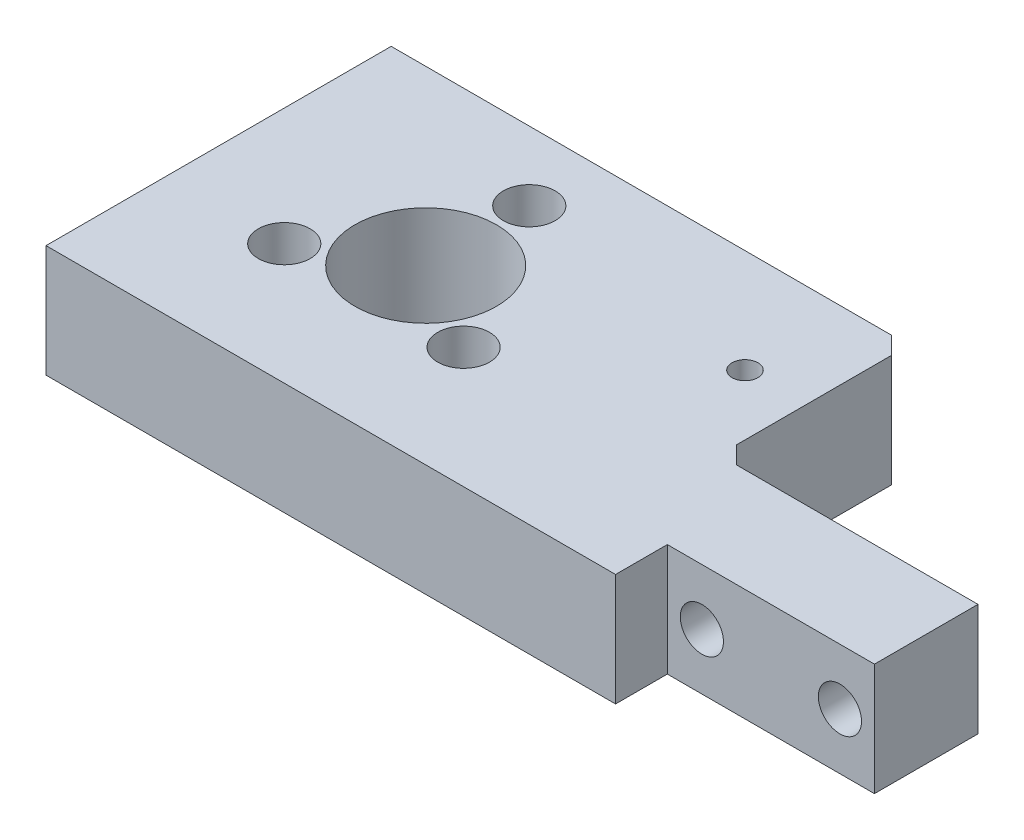
ISO-10303-21;
HEADER;
FILE_DESCRIPTION(('STEP AP214'),'2;1');
FILE_NAME('part.step','',(''),(''),'','','');
FILE_SCHEMA(('AUTOMOTIVE_DESIGN { 1 0 10303 214 1 1 1 1 }'));
ENDSEC;
DATA;
#1=APPLICATION_CONTEXT('core data for automotive mechanical design processes');
#2=APPLICATION_PROTOCOL_DEFINITION('international standard','automotive_design',2000,#1);
#3=PRODUCT_CONTEXT('',#1,'mechanical');
#4=PRODUCT('Part','Part','',(#3));
#5=PRODUCT_RELATED_PRODUCT_CATEGORY('part','',(#4));
#6=PRODUCT_DEFINITION_FORMATION('','',#4);
#7=PRODUCT_DEFINITION_CONTEXT('part definition',#1,'design');
#8=PRODUCT_DEFINITION('design','',#6,#7);
#9=PRODUCT_DEFINITION_SHAPE('','',#8);
#10=(LENGTH_UNIT() NAMED_UNIT(*) SI_UNIT(.MILLI.,.METRE.));
#11=(NAMED_UNIT(*) PLANE_ANGLE_UNIT() SI_UNIT($,.RADIAN.));
#12=(NAMED_UNIT(*) SI_UNIT($,.STERADIAN.) SOLID_ANGLE_UNIT());
#13=UNCERTAINTY_MEASURE_WITH_UNIT(LENGTH_MEASURE(1.E-05),#10,'distance_accuracy_value','');
#14=(GEOMETRIC_REPRESENTATION_CONTEXT(3) GLOBAL_UNCERTAINTY_ASSIGNED_CONTEXT((#13)) GLOBAL_UNIT_ASSIGNED_CONTEXT((#10,
#11,#12)) REPRESENTATION_CONTEXT('',''));
#15=CARTESIAN_POINT('',(0.,0.,0.));
#16=DIRECTION('',(0.,0.,1.));
#17=DIRECTION('',(1.,0.,0.));
#18=AXIS2_PLACEMENT_3D('',#15,#16,#17);
#19=CARTESIAN_POINT('',(-12.,6.5,10.));
#20=DIRECTION('',(0.,0.,-1.));
#21=DIRECTION('',(-1.,0.,0.));
#22=AXIS2_PLACEMENT_3D('',#19,#20,#21);
#23=PLANE('',#22);
#24=DIRECTION('',(1.,0.,0.));
#25=VECTOR('',#24,1.);
#26=CARTESIAN_POINT('',(-12.,0.,10.));
#27=LINE('',#26,#25);
#28=CARTESIAN_POINT('',(-12.,0.,10.));
#29=VERTEX_POINT('',#28);
#30=CARTESIAN_POINT('',(21.,0.,10.));
#31=VERTEX_POINT('',#30);
#32=EDGE_CURVE('E175',#29,#31,#27,.T.);
#33=ORIENTED_EDGE('',*,*,#32,.T.);
#34=DIRECTION('',(0.,1.,0.));
#35=VECTOR('',#34,1.);
#36=CARTESIAN_POINT('',(21.,0.,10.));
#37=LINE('',#36,#35);
#38=CARTESIAN_POINT('',(21.,6.5,10.));
#39=VERTEX_POINT('',#38);
#40=EDGE_CURVE('E259',#31,#39,#37,.T.);
#41=ORIENTED_EDGE('',*,*,#40,.T.);
#42=DIRECTION('',(1.,0.,0.));
#43=VECTOR('',#42,1.);
#44=CARTESIAN_POINT('',(-12.,6.5,10.));
#45=LINE('',#44,#43);
#46=CARTESIAN_POINT('',(-12.,6.5,10.));
#47=VERTEX_POINT('',#46);
#48=EDGE_CURVE('E177',#47,#39,#45,.T.);
#49=ORIENTED_EDGE('',*,*,#48,.F.);
#50=DIRECTION('',(0.,-1.,0.));
#51=VECTOR('',#50,1.);
#52=CARTESIAN_POINT('',(-12.,6.5,10.));
#53=LINE('',#52,#51);
#54=EDGE_CURVE('E180',#47,#29,#53,.T.);
#55=ORIENTED_EDGE('',*,*,#54,.T.);
#56=EDGE_LOOP('',(#33,#41,#49,#55));
#57=FACE_BOUND('',#56,.T.);
#58=ADVANCED_FACE('F39',(#57),#23,.F.);
#59=CARTESIAN_POINT('',(0.,6.5,0.));
#60=DIRECTION('',(0.,1.,0.));
#61=DIRECTION('',(0.,0.,1.));
#62=AXIS2_PLACEMENT_3D('',#59,#60,#61);
#63=PLANE('',#62);
#64=DIRECTION('',(0.,0.,1.));
#65=VECTOR('',#64,1.);
#66=CARTESIAN_POINT('',(33.,6.5,0.999999999999999));
#67=LINE('',#66,#65);
#68=CARTESIAN_POINT('',(33.,6.5,0.999999999999999));
#69=VERTEX_POINT('',#68);
#70=CARTESIAN_POINT('',(33.,6.5,7.));
#71=VERTEX_POINT('',#70);
#72=EDGE_CURVE('E116',#69,#71,#67,.T.);
#73=ORIENTED_EDGE('',*,*,#72,.F.);
#74=DIRECTION('',(1.,0.,0.));
#75=VECTOR('',#74,1.);
#76=CARTESIAN_POINT('',(35.,6.5,0.999999999999999));
#77=LINE('',#76,#75);
#78=CARTESIAN_POINT('',(19.,6.5,1.));
#79=VERTEX_POINT('',#78);
#80=EDGE_CURVE('E127',#79,#69,#77,.T.);
#81=ORIENTED_EDGE('',*,*,#80,.F.);
#82=DIRECTION('',(0.707106781186551,0.,0.707106781186545));
#83=VECTOR('',#82,1.);
#84=CARTESIAN_POINT('',(19.,6.5,1.));
#85=LINE('',#84,#83);
#86=CARTESIAN_POINT('',(18.,6.5,0.));
#87=VERTEX_POINT('',#86);
#88=EDGE_CURVE('E47',#79,#87,#85,.F.);
#89=ORIENTED_EDGE('',*,*,#88,.T.);
#90=DIRECTION('',(0.,0.,1.));
#91=VECTOR('',#90,1.);
#92=CARTESIAN_POINT('',(18.,6.5,-10.));
#93=LINE('',#92,#91);
#94=CARTESIAN_POINT('',(18.,6.5,-9.));
#95=VERTEX_POINT('',#94);
#96=EDGE_CURVE('E137',#95,#87,#93,.T.);
#97=ORIENTED_EDGE('',*,*,#96,.F.);
#98=DIRECTION('',(0.70710678118655,0.,0.707106781186545));
#99=VECTOR('',#98,1.);
#100=CARTESIAN_POINT('',(13.4999999999999,6.5,-13.5));
#101=LINE('',#100,#99);
#102=CARTESIAN_POINT('',(17.,6.5,-10.));
#103=VERTEX_POINT('',#102);
#104=EDGE_CURVE('E202',#95,#103,#101,.F.);
#105=ORIENTED_EDGE('',*,*,#104,.T.);
#106=DIRECTION('',(-1.,0.,0.));
#107=VECTOR('',#106,1.);
#108=CARTESIAN_POINT('',(-12.,6.5,-10.));
#109=LINE('',#108,#107);
#110=CARTESIAN_POINT('',(-12.,6.5,-10.));
#111=VERTEX_POINT('',#110);
#112=EDGE_CURVE('E172',#103,#111,#109,.T.);
#113=ORIENTED_EDGE('',*,*,#112,.T.);
#114=DIRECTION('',(0.,0.,1.));
#115=VECTOR('',#114,1.);
#116=CARTESIAN_POINT('',(-12.,6.5,10.));
#117=LINE('',#116,#115);
#118=EDGE_CURVE('E174',#111,#47,#117,.T.);
#119=ORIENTED_EDGE('',*,*,#118,.T.);
#120=ORIENTED_EDGE('',*,*,#48,.T.);
#121=DIRECTION('',(0.,0.,1.));
#122=VECTOR('',#121,1.);
#123=CARTESIAN_POINT('',(21.,6.5,10.));
#124=LINE('',#123,#122);
#125=CARTESIAN_POINT('',(21.,6.5,7.));
#126=VERTEX_POINT('',#125);
#127=EDGE_CURVE('E257',#126,#39,#124,.T.);
#128=ORIENTED_EDGE('',*,*,#127,.F.);
#129=DIRECTION('',(-1.,0.,0.));
#130=VECTOR('',#129,1.);
#131=CARTESIAN_POINT('',(21.,6.5,7.));
#132=LINE('',#131,#130);
#133=EDGE_CURVE('E130',#71,#126,#132,.T.);
#134=ORIENTED_EDGE('',*,*,#133,.F.);
#135=EDGE_LOOP('',(#73,#81,#89,#97,#105,#113,#119,#120,#128,#134));
#136=FACE_BOUND('',#135,.T.);
#137=CARTESIAN_POINT('',(14.5,6.5,-3.99875810978174));
#138=DIRECTION('',(0.,1.,0.));
#139=DIRECTION('',(0.,0.,1.));
#140=AXIS2_PLACEMENT_3D('',#137,#138,#139);
#141=CIRCLE('',#140,0.75);
#142=CARTESIAN_POINT('',(14.5,6.5,-3.24875810978174));
#143=VERTEX_POINT('',#142);
#144=EDGE_CURVE('E120',#143,#143,#141,.T.);
#145=ORIENTED_EDGE('',*,*,#144,.F.);
#146=EDGE_LOOP('',(#145));
#147=FACE_BOUND('',#146,.T.);
#148=CARTESIAN_POINT('',(5.19615242270701,6.5,2.99999999999978));
#149=DIRECTION('',(0.,1.,0.));
#150=DIRECTION('',(0.,0.,1.));
#151=AXIS2_PLACEMENT_3D('',#148,#149,#150);
#152=CIRCLE('',#151,1.50000000000033);
#153=CARTESIAN_POINT('',(5.19615242270701,6.5,1.49999999999945));
#154=VERTEX_POINT('',#153);
#155=EDGE_CURVE('E154',#154,#154,#152,.T.);
#156=ORIENTED_EDGE('',*,*,#155,.F.);
#157=EDGE_LOOP('',(#156));
#158=FACE_BOUND('',#157,.T.);
#159=CARTESIAN_POINT('',(0.,6.5,-6.));
#160=DIRECTION('',(0.,1.,0.));
#161=DIRECTION('',(0.,0.,1.));
#162=AXIS2_PLACEMENT_3D('',#159,#160,#161);
#163=CIRCLE('',#162,1.5);
#164=CARTESIAN_POINT('',(0.,6.5,-7.5));
#165=VERTEX_POINT('',#164);
#166=EDGE_CURVE('E166',#165,#165,#163,.T.);
#167=ORIENTED_EDGE('',*,*,#166,.F.);
#168=EDGE_LOOP('',(#167));
#169=FACE_BOUND('',#168,.T.);
#170=CARTESIAN_POINT('',(0.,6.5,0.));
#171=DIRECTION('',(0.,1.,0.));
#172=DIRECTION('',(0.,0.,1.));
#173=AXIS2_PLACEMENT_3D('',#170,#171,#172);
#174=CIRCLE('',#173,4.1);
#175=CARTESIAN_POINT('',(0.,6.5,-4.1));
#176=VERTEX_POINT('',#175);
#177=EDGE_CURVE('E160',#176,#176,#174,.T.);
#178=ORIENTED_EDGE('',*,*,#177,.F.);
#179=EDGE_LOOP('',(#178));
#180=FACE_BOUND('',#179,.T.);
#181=CARTESIAN_POINT('',(-5.19615242270625,6.5,3.00000000000022));
#182=DIRECTION('',(0.,1.,0.));
#183=DIRECTION('',(0.,0.,1.));
#184=AXIS2_PLACEMENT_3D('',#181,#182,#183);
#185=CIRCLE('',#184,1.50000000000049);
#186=CARTESIAN_POINT('',(-5.19615242270625,6.5,1.49999999999974));
#187=VERTEX_POINT('',#186);
#188=EDGE_CURVE('E146',#187,#187,#185,.T.);
#189=ORIENTED_EDGE('',*,*,#188,.F.);
#190=EDGE_LOOP('',(#189));
#191=FACE_BOUND('',#190,.T.);
#192=ADVANCED_FACE('F125',(#136,#147,#158,#169,#180,#191),#63,.T.);
#193=CARTESIAN_POINT('',(0.,0.,0.));
#194=DIRECTION('',(0.,1.,0.));
#195=DIRECTION('',(0.,0.,1.));
#196=AXIS2_PLACEMENT_3D('',#193,#194,#195);
#197=PLANE('',#196);
#198=CARTESIAN_POINT('',(14.5,0.,-3.99875810978174));
#199=DIRECTION('',(0.,1.,0.));
#200=DIRECTION('',(0.,0.,1.));
#201=AXIS2_PLACEMENT_3D('',#198,#199,#200);
#202=CIRCLE('',#201,0.75);
#203=CARTESIAN_POINT('',(14.5,0.,-3.24875810978174));
#204=VERTEX_POINT('',#203);
#205=EDGE_CURVE('E280',#204,#204,#202,.T.);
#206=ORIENTED_EDGE('',*,*,#205,.T.);
#207=EDGE_LOOP('',(#206));
#208=FACE_BOUND('',#207,.T.);
#209=DIRECTION('',(1.,0.,0.));
#210=VECTOR('',#209,1.);
#211=CARTESIAN_POINT('',(35.,0.,0.999999999999999));
#212=LINE('',#211,#210);
#213=CARTESIAN_POINT('',(19.,0.,1.));
#214=VERTEX_POINT('',#213);
#215=CARTESIAN_POINT('',(33.,0.,0.999999999999999));
#216=VERTEX_POINT('',#215);
#217=EDGE_CURVE('E139',#214,#216,#212,.T.);
#218=ORIENTED_EDGE('',*,*,#217,.T.);
#219=DIRECTION('',(0.,0.,1.));
#220=VECTOR('',#219,1.);
#221=CARTESIAN_POINT('',(33.,0.,0.999999999999999));
#222=LINE('',#221,#220);
#223=CARTESIAN_POINT('',(33.,0.,7.));
#224=VERTEX_POINT('',#223);
#225=EDGE_CURVE('E54',#216,#224,#222,.T.);
#226=ORIENTED_EDGE('',*,*,#225,.T.);
#227=DIRECTION('',(-1.,0.,0.));
#228=VECTOR('',#227,1.);
#229=CARTESIAN_POINT('',(21.,0.,7.));
#230=LINE('',#229,#228);
#231=CARTESIAN_POINT('',(21.,0.,7.));
#232=VERTEX_POINT('',#231);
#233=EDGE_CURVE('E264',#224,#232,#230,.T.);
#234=ORIENTED_EDGE('',*,*,#233,.T.);
#235=DIRECTION('',(0.,0.,1.));
#236=VECTOR('',#235,1.);
#237=CARTESIAN_POINT('',(21.,0.,10.));
#238=LINE('',#237,#236);
#239=EDGE_CURVE('E268',#232,#31,#238,.T.);
#240=ORIENTED_EDGE('',*,*,#239,.T.);
#241=ORIENTED_EDGE('',*,*,#32,.F.);
#242=DIRECTION('',(0.,0.,1.));
#243=VECTOR('',#242,1.);
#244=CARTESIAN_POINT('',(-12.,0.,10.));
#245=LINE('',#244,#243);
#246=CARTESIAN_POINT('',(-12.,0.,-10.));
#247=VERTEX_POINT('',#246);
#248=EDGE_CURVE('E182',#247,#29,#245,.T.);
#249=ORIENTED_EDGE('',*,*,#248,.F.);
#250=DIRECTION('',(-1.,0.,0.));
#251=VECTOR('',#250,1.);
#252=CARTESIAN_POINT('',(-12.,0.,-10.));
#253=LINE('',#252,#251);
#254=CARTESIAN_POINT('',(17.,0.,-10.));
#255=VERTEX_POINT('',#254);
#256=EDGE_CURVE('E169',#255,#247,#253,.T.);
#257=ORIENTED_EDGE('',*,*,#256,.F.);
#258=DIRECTION('',(-0.70710678118655,0.,-0.707106781186545));
#259=VECTOR('',#258,1.);
#260=CARTESIAN_POINT('',(18.,0.,-9.));
#261=LINE('',#260,#259);
#262=CARTESIAN_POINT('',(18.,0.,-9.));
#263=VERTEX_POINT('',#262);
#264=EDGE_CURVE('E206',#255,#263,#261,.F.);
#265=ORIENTED_EDGE('',*,*,#264,.T.);
#266=DIRECTION('',(0.,0.,1.));
#267=VECTOR('',#266,1.);
#268=CARTESIAN_POINT('',(18.,0.,-10.));
#269=LINE('',#268,#267);
#270=CARTESIAN_POINT('',(18.,0.,0.));
#271=VERTEX_POINT('',#270);
#272=EDGE_CURVE('E136',#263,#271,#269,.T.);
#273=ORIENTED_EDGE('',*,*,#272,.T.);
#274=DIRECTION('',(-0.707106781186551,0.,-0.707106781186545));
#275=VECTOR('',#274,1.);
#276=CARTESIAN_POINT('',(8.99999999999993,0.,-9.00000000000001));
#277=LINE('',#276,#275);
#278=EDGE_CURVE('E12',#271,#214,#277,.F.);
#279=ORIENTED_EDGE('',*,*,#278,.T.);
#280=EDGE_LOOP('',(#218,#226,#234,#240,#241,#249,#257,#265,#273,#279));
#281=FACE_BOUND('',#280,.T.);
#282=CARTESIAN_POINT('',(0.,0.,-6.));
#283=DIRECTION('',(0.,1.,0.));
#284=DIRECTION('',(0.,0.,1.));
#285=AXIS2_PLACEMENT_3D('',#282,#283,#284);
#286=CIRCLE('',#285,1.5);
#287=CARTESIAN_POINT('',(0.,0.,-7.5));
#288=VERTEX_POINT('',#287);
#289=EDGE_CURVE('E163',#288,#288,#286,.T.);
#290=ORIENTED_EDGE('',*,*,#289,.T.);
#291=EDGE_LOOP('',(#290));
#292=FACE_BOUND('',#291,.T.);
#293=CARTESIAN_POINT('',(0.,0.,0.));
#294=DIRECTION('',(0.,1.,0.));
#295=DIRECTION('',(0.,0.,1.));
#296=AXIS2_PLACEMENT_3D('',#293,#294,#295);
#297=CIRCLE('',#296,4.1);
#298=CARTESIAN_POINT('',(0.,0.,-4.1));
#299=VERTEX_POINT('',#298);
#300=EDGE_CURVE('E157',#299,#299,#297,.T.);
#301=ORIENTED_EDGE('',*,*,#300,.T.);
#302=EDGE_LOOP('',(#301));
#303=FACE_BOUND('',#302,.T.);
#304=CARTESIAN_POINT('',(5.19615242270701,0.,2.99999999999978));
#305=DIRECTION('',(0.,1.,0.));
#306=DIRECTION('',(0.,0.,1.));
#307=AXIS2_PLACEMENT_3D('',#304,#305,#306);
#308=CIRCLE('',#307,1.50000000000033);
#309=CARTESIAN_POINT('',(5.19615242270701,0.,1.49999999999945));
#310=VERTEX_POINT('',#309);
#311=EDGE_CURVE('E149',#310,#310,#308,.T.);
#312=ORIENTED_EDGE('',*,*,#311,.T.);
#313=EDGE_LOOP('',(#312));
#314=FACE_BOUND('',#313,.T.);
#315=CARTESIAN_POINT('',(-5.19615242270625,0.,3.00000000000022));
#316=DIRECTION('',(0.,1.,0.));
#317=DIRECTION('',(0.,0.,1.));
#318=AXIS2_PLACEMENT_3D('',#315,#316,#317);
#319=CIRCLE('',#318,1.50000000000049);
#320=CARTESIAN_POINT('',(-5.19615242270625,0.,1.49999999999974));
#321=VERTEX_POINT('',#320);
#322=EDGE_CURVE('E150',#321,#321,#319,.T.);
#323=ORIENTED_EDGE('',*,*,#322,.T.);
#324=EDGE_LOOP('',(#323));
#325=FACE_BOUND('',#324,.T.);
#326=ADVANCED_FACE('F230',(#208,#281,#292,#303,#314,#325),#197,.F.);
#327=CARTESIAN_POINT('',(-12.,6.5,-10.));
#328=DIRECTION('',(0.,0.,1.));
#329=DIRECTION('',(1.,0.,0.));
#330=AXIS2_PLACEMENT_3D('',#327,#328,#329);
#331=PLANE('',#330);
#332=ORIENTED_EDGE('',*,*,#112,.F.);
#333=DIRECTION('',(0.,-1.,0.));
#334=VECTOR('',#333,1.);
#335=CARTESIAN_POINT('',(17.,6.5,-10.));
#336=LINE('',#335,#334);
#337=EDGE_CURVE('E204',#103,#255,#336,.T.);
#338=ORIENTED_EDGE('',*,*,#337,.T.);
#339=ORIENTED_EDGE('',*,*,#256,.T.);
#340=DIRECTION('',(0.,-1.,0.));
#341=VECTOR('',#340,1.);
#342=CARTESIAN_POINT('',(-12.,6.5,-10.));
#343=LINE('',#342,#341);
#344=EDGE_CURVE('E188',#111,#247,#343,.T.);
#345=ORIENTED_EDGE('',*,*,#344,.F.);
#346=EDGE_LOOP('',(#332,#338,#339,#345));
#347=FACE_BOUND('',#346,.T.);
#348=ADVANCED_FACE('F238',(#347),#331,.F.);
#349=CARTESIAN_POINT('',(-12.,6.5,10.));
#350=DIRECTION('',(1.,0.,0.));
#351=DIRECTION('',(0.,0.,-1.));
#352=AXIS2_PLACEMENT_3D('',#349,#350,#351);
#353=PLANE('',#352);
#354=ORIENTED_EDGE('',*,*,#248,.T.);
#355=ORIENTED_EDGE('',*,*,#54,.F.);
#356=ORIENTED_EDGE('',*,*,#118,.F.);
#357=ORIENTED_EDGE('',*,*,#344,.T.);
#358=EDGE_LOOP('',(#354,#355,#356,#357));
#359=FACE_BOUND('',#358,.T.);
#360=ADVANCED_FACE('F234',(#359),#353,.F.);
#361=CARTESIAN_POINT('',(0.,6.5,-6.));
#362=DIRECTION('',(0.,-1.,0.));
#363=DIRECTION('',(0.,0.,-1.));
#364=AXIS2_PLACEMENT_3D('',#361,#362,#363);
#365=CYLINDRICAL_SURFACE('',#364,1.5);
#366=CARTESIAN_POINT('',(0.,6.5,-7.5));
#367=CARTESIAN_POINT('',(0.,6.43229166666667,-7.5));
#368=CARTESIAN_POINT('',(0.,6.36458333333333,-7.5));
#369=CARTESIAN_POINT('',(0.,6.22916666666667,-7.5));
#370=CARTESIAN_POINT('',(0.,6.16145833333333,-7.5));
#371=CARTESIAN_POINT('',(0.,6.02604166666667,-7.5));
#372=CARTESIAN_POINT('',(0.,5.95833333333333,-7.5));
#373=CARTESIAN_POINT('',(0.,5.82291666666667,-7.5));
#374=CARTESIAN_POINT('',(0.,5.75520833333333,-7.5));
#375=CARTESIAN_POINT('',(0.,5.61979166666667,-7.5));
#376=CARTESIAN_POINT('',(0.,5.55208333333333,-7.5));
#377=CARTESIAN_POINT('',(0.,5.41666666666667,-7.5));
#378=CARTESIAN_POINT('',(0.,5.34895833333333,-7.5));
#379=CARTESIAN_POINT('',(0.,5.21354166666667,-7.5));
#380=CARTESIAN_POINT('',(0.,5.14583333333333,-7.5));
#381=CARTESIAN_POINT('',(0.,5.01041666666667,-7.5));
#382=CARTESIAN_POINT('',(0.,4.94270833333333,-7.5));
#383=CARTESIAN_POINT('',(0.,4.80729166666667,-7.5));
#384=CARTESIAN_POINT('',(0.,4.73958333333333,-7.5));
#385=CARTESIAN_POINT('',(0.,4.60416666666667,-7.5));
#386=CARTESIAN_POINT('',(0.,4.53645833333333,-7.5));
#387=CARTESIAN_POINT('',(0.,4.40104166666667,-7.5));
#388=CARTESIAN_POINT('',(0.,4.33333333333333,-7.5));
#389=CARTESIAN_POINT('',(0.,4.19791666666667,-7.5));
#390=CARTESIAN_POINT('',(0.,4.13020833333333,-7.5));
#391=CARTESIAN_POINT('',(0.,3.99479166666667,-7.5));
#392=CARTESIAN_POINT('',(0.,3.92708333333333,-7.5));
#393=CARTESIAN_POINT('',(0.,3.79166666666667,-7.5));
#394=CARTESIAN_POINT('',(0.,3.72395833333333,-7.5));
#395=CARTESIAN_POINT('',(0.,3.58854166666667,-7.5));
#396=CARTESIAN_POINT('',(0.,3.52083333333333,-7.5));
#397=CARTESIAN_POINT('',(0.,3.38541666666667,-7.5));
#398=CARTESIAN_POINT('',(0.,3.31770833333333,-7.5));
#399=CARTESIAN_POINT('',(0.,3.18229166666667,-7.5));
#400=CARTESIAN_POINT('',(0.,3.11458333333333,-7.5));
#401=CARTESIAN_POINT('',(0.,2.97916666666667,-7.5));
#402=CARTESIAN_POINT('',(0.,2.91145833333333,-7.5));
#403=CARTESIAN_POINT('',(0.,2.77604166666667,-7.5));
#404=CARTESIAN_POINT('',(0.,2.70833333333333,-7.5));
#405=CARTESIAN_POINT('',(0.,2.57291666666667,-7.5));
#406=CARTESIAN_POINT('',(0.,2.50520833333333,-7.5));
#407=CARTESIAN_POINT('',(0.,2.36979166666667,-7.5));
#408=CARTESIAN_POINT('',(0.,2.30208333333333,-7.5));
#409=CARTESIAN_POINT('',(0.,2.16666666666667,-7.5));
#410=CARTESIAN_POINT('',(0.,2.09895833333333,-7.5));
#411=CARTESIAN_POINT('',(0.,1.96354166666667,-7.5));
#412=CARTESIAN_POINT('',(0.,1.89583333333333,-7.5));
#413=CARTESIAN_POINT('',(0.,1.76041666666667,-7.5));
#414=CARTESIAN_POINT('',(0.,1.69270833333333,-7.5));
#415=CARTESIAN_POINT('',(0.,1.55729166666667,-7.5));
#416=CARTESIAN_POINT('',(0.,1.48958333333333,-7.5));
#417=CARTESIAN_POINT('',(0.,1.35416666666667,-7.5));
#418=CARTESIAN_POINT('',(0.,1.28645833333333,-7.5));
#419=CARTESIAN_POINT('',(0.,1.15104166666667,-7.5));
#420=CARTESIAN_POINT('',(0.,1.08333333333333,-7.5));
#421=CARTESIAN_POINT('',(0.,0.947916666666667,-7.5));
#422=CARTESIAN_POINT('',(0.,0.880208333333333,-7.5));
#423=CARTESIAN_POINT('',(0.,0.744791666666667,-7.5));
#424=CARTESIAN_POINT('',(0.,0.677083333333333,-7.5));
#425=CARTESIAN_POINT('',(0.,0.541666666666667,-7.5));
#426=CARTESIAN_POINT('',(0.,0.473958333333333,-7.5));
#427=CARTESIAN_POINT('',(0.,0.338541666666667,-7.5));
#428=CARTESIAN_POINT('',(0.,0.270833333333334,-7.5));
#429=CARTESIAN_POINT('',(0.,0.135416666666667,-7.5));
#430=CARTESIAN_POINT('',(0.,0.0677083333333334,-7.5));
#431=CARTESIAN_POINT('',(0.,0.,-7.5));
#432=B_SPLINE_CURVE_WITH_KNOTS('',3,(#366,#367,#368,#369,#370,#371,#372,#373,#374,#375,#376,
#377,#378,#379,#380,#381,#382,#383,#384,#385,#386,#387,#388,#389,#390,#391,#392,#393,#394,#395,
#396,#397,#398,#399,#400,#401,#402,#403,#404,#405,#406,#407,#408,#409,#410,#411,#412,#413,#414,
#415,#416,#417,#418,#419,#420,#421,#422,#423,#424,#425,#426,#427,#428,#429,#430,#431),
.UNSPECIFIED.,.F.,.F.,(4,2,2,2,2,2,2,2,2,2,2,2,2,2,2,2,2,2,2,2,2,2,2,2,2,2,2,2,2,2,2,2,4),(0.,
0.203124999999999,0.40625,0.609375,0.812499999999999,1.015625,1.21875,1.421875,1.625,1.828125,
2.03125,2.234375,2.4375,2.640625,2.84375,3.046875,3.25,3.453125,3.65625,3.859375,4.0625,
4.265625,4.46875,4.671875,4.875,5.078125,5.28125,5.484375,5.6875,5.890625,6.09375,6.296875,6.5),.UNSPECIFIED.);
#433=EDGE_CURVE('BSEAM237',#165,#288,#432,.T.);
#434=ORIENTED_EDGE('',*,*,#166,.T.);
#435=ORIENTED_EDGE('',*,*,#289,.F.);
#436=ORIENTED_EDGE('',*,*,#433,.T.);
#437=ORIENTED_EDGE('',*,*,#433,.F.);
#438=EDGE_LOOP('',(#434,#436,#435,#437));
#439=FACE_BOUND('',#438,.T.);
#440=ADVANCED_FACE('F237',(#439),#365,.F.);
#441=CARTESIAN_POINT('',(0.,6.5,0.));
#442=DIRECTION('',(0.,-1.,0.));
#443=DIRECTION('',(0.,0.,-1.));
#444=AXIS2_PLACEMENT_3D('',#441,#442,#443);
#445=CYLINDRICAL_SURFACE('',#444,4.1);
#446=CARTESIAN_POINT('',(0.,6.5,-4.1));
#447=CARTESIAN_POINT('',(0.,6.43229166666667,-4.1));
#448=CARTESIAN_POINT('',(0.,6.36458333333333,-4.1));
#449=CARTESIAN_POINT('',(0.,6.22916666666667,-4.1));
#450=CARTESIAN_POINT('',(0.,6.16145833333333,-4.1));
#451=CARTESIAN_POINT('',(0.,6.02604166666667,-4.1));
#452=CARTESIAN_POINT('',(0.,5.95833333333333,-4.1));
#453=CARTESIAN_POINT('',(0.,5.82291666666667,-4.1));
#454=CARTESIAN_POINT('',(0.,5.75520833333333,-4.1));
#455=CARTESIAN_POINT('',(0.,5.61979166666667,-4.1));
#456=CARTESIAN_POINT('',(0.,5.55208333333333,-4.1));
#457=CARTESIAN_POINT('',(0.,5.41666666666667,-4.1));
#458=CARTESIAN_POINT('',(0.,5.34895833333333,-4.1));
#459=CARTESIAN_POINT('',(0.,5.21354166666667,-4.1));
#460=CARTESIAN_POINT('',(0.,5.14583333333333,-4.1));
#461=CARTESIAN_POINT('',(0.,5.01041666666667,-4.1));
#462=CARTESIAN_POINT('',(0.,4.94270833333333,-4.1));
#463=CARTESIAN_POINT('',(0.,4.80729166666667,-4.1));
#464=CARTESIAN_POINT('',(0.,4.73958333333333,-4.1));
#465=CARTESIAN_POINT('',(0.,4.60416666666667,-4.1));
#466=CARTESIAN_POINT('',(0.,4.53645833333333,-4.1));
#467=CARTESIAN_POINT('',(0.,4.40104166666667,-4.1));
#468=CARTESIAN_POINT('',(0.,4.33333333333333,-4.1));
#469=CARTESIAN_POINT('',(0.,4.19791666666667,-4.1));
#470=CARTESIAN_POINT('',(0.,4.13020833333333,-4.1));
#471=CARTESIAN_POINT('',(0.,3.99479166666667,-4.1));
#472=CARTESIAN_POINT('',(0.,3.92708333333333,-4.1));
#473=CARTESIAN_POINT('',(0.,3.79166666666667,-4.1));
#474=CARTESIAN_POINT('',(0.,3.72395833333333,-4.1));
#475=CARTESIAN_POINT('',(0.,3.58854166666667,-4.1));
#476=CARTESIAN_POINT('',(0.,3.52083333333333,-4.1));
#477=CARTESIAN_POINT('',(0.,3.38541666666667,-4.1));
#478=CARTESIAN_POINT('',(0.,3.31770833333333,-4.1));
#479=CARTESIAN_POINT('',(0.,3.18229166666667,-4.1));
#480=CARTESIAN_POINT('',(0.,3.11458333333333,-4.1));
#481=CARTESIAN_POINT('',(0.,2.97916666666667,-4.1));
#482=CARTESIAN_POINT('',(0.,2.91145833333333,-4.1));
#483=CARTESIAN_POINT('',(0.,2.77604166666667,-4.1));
#484=CARTESIAN_POINT('',(0.,2.70833333333333,-4.1));
#485=CARTESIAN_POINT('',(0.,2.57291666666667,-4.1));
#486=CARTESIAN_POINT('',(0.,2.50520833333333,-4.1));
#487=CARTESIAN_POINT('',(0.,2.36979166666667,-4.1));
#488=CARTESIAN_POINT('',(0.,2.30208333333333,-4.1));
#489=CARTESIAN_POINT('',(0.,2.16666666666667,-4.1));
#490=CARTESIAN_POINT('',(0.,2.09895833333333,-4.1));
#491=CARTESIAN_POINT('',(0.,1.96354166666667,-4.1));
#492=CARTESIAN_POINT('',(0.,1.89583333333333,-4.1));
#493=CARTESIAN_POINT('',(0.,1.76041666666667,-4.1));
#494=CARTESIAN_POINT('',(0.,1.69270833333333,-4.1));
#495=CARTESIAN_POINT('',(0.,1.55729166666667,-4.1));
#496=CARTESIAN_POINT('',(0.,1.48958333333333,-4.1));
#497=CARTESIAN_POINT('',(0.,1.35416666666667,-4.1));
#498=CARTESIAN_POINT('',(0.,1.28645833333333,-4.1));
#499=CARTESIAN_POINT('',(0.,1.15104166666667,-4.1));
#500=CARTESIAN_POINT('',(0.,1.08333333333333,-4.1));
#501=CARTESIAN_POINT('',(0.,0.947916666666667,-4.1));
#502=CARTESIAN_POINT('',(0.,0.880208333333333,-4.1));
#503=CARTESIAN_POINT('',(0.,0.744791666666667,-4.1));
#504=CARTESIAN_POINT('',(0.,0.677083333333333,-4.1));
#505=CARTESIAN_POINT('',(0.,0.541666666666667,-4.1));
#506=CARTESIAN_POINT('',(0.,0.473958333333333,-4.1));
#507=CARTESIAN_POINT('',(0.,0.338541666666667,-4.1));
#508=CARTESIAN_POINT('',(0.,0.270833333333334,-4.1));
#509=CARTESIAN_POINT('',(0.,0.135416666666667,-4.1));
#510=CARTESIAN_POINT('',(0.,0.0677083333333334,-4.1));
#511=CARTESIAN_POINT('',(0.,0.,-4.1));
#512=B_SPLINE_CURVE_WITH_KNOTS('',3,(#446,#447,#448,#449,#450,#451,#452,#453,#454,#455,#456,
#457,#458,#459,#460,#461,#462,#463,#464,#465,#466,#467,#468,#469,#470,#471,#472,#473,#474,#475,
#476,#477,#478,#479,#480,#481,#482,#483,#484,#485,#486,#487,#488,#489,#490,#491,#492,#493,#494,
#495,#496,#497,#498,#499,#500,#501,#502,#503,#504,#505,#506,#507,#508,#509,#510,#511),
.UNSPECIFIED.,.F.,.F.,(4,2,2,2,2,2,2,2,2,2,2,2,2,2,2,2,2,2,2,2,2,2,2,2,2,2,2,2,2,2,2,2,4),(0.,
0.203125,0.40625,0.609375000000001,0.812500000000001,1.015625,1.21875,1.421875,1.625,1.828125,
2.03125,2.234375,2.4375,2.640625,2.84375,3.046875,3.25,3.453125,3.65625,3.859375,4.0625,
4.265625,4.46875,4.671875,4.875,5.078125,5.28125,5.484375,5.6875,5.890625,6.09375,6.296875,6.5),.UNSPECIFIED.);
#513=EDGE_CURVE('BSEAM317',#176,#299,#512,.T.);
#514=ORIENTED_EDGE('',*,*,#177,.T.);
#515=ORIENTED_EDGE('',*,*,#300,.F.);
#516=ORIENTED_EDGE('',*,*,#513,.T.);
#517=ORIENTED_EDGE('',*,*,#513,.F.);
#518=EDGE_LOOP('',(#514,#516,#515,#517));
#519=FACE_BOUND('',#518,.T.);
#520=ADVANCED_FACE('F317',(#519),#445,.F.);
#521=CARTESIAN_POINT('',(5.19615242270701,6.5,2.99999999999978));
#522=DIRECTION('',(0.,-1.,0.));
#523=DIRECTION('',(0.,0.,-1.));
#524=AXIS2_PLACEMENT_3D('',#521,#522,#523);
#525=CYLINDRICAL_SURFACE('',#524,1.50000000000033);
#526=CARTESIAN_POINT('',(5.19615242270701,6.5,1.49999999999945));
#527=CARTESIAN_POINT('',(5.19615242270701,6.43229166666667,1.49999999999945));
#528=CARTESIAN_POINT('',(5.19615242270701,6.36458333333333,1.49999999999945));
#529=CARTESIAN_POINT('',(5.19615242270701,6.22916666666667,1.49999999999945));
#530=CARTESIAN_POINT('',(5.19615242270701,6.16145833333333,1.49999999999945));
#531=CARTESIAN_POINT('',(5.19615242270701,6.02604166666667,1.49999999999945));
#532=CARTESIAN_POINT('',(5.19615242270701,5.95833333333333,1.49999999999945));
#533=CARTESIAN_POINT('',(5.19615242270701,5.82291666666667,1.49999999999945));
#534=CARTESIAN_POINT('',(5.19615242270701,5.75520833333333,1.49999999999945));
#535=CARTESIAN_POINT('',(5.19615242270701,5.61979166666667,1.49999999999945));
#536=CARTESIAN_POINT('',(5.19615242270701,5.55208333333333,1.49999999999945));
#537=CARTESIAN_POINT('',(5.19615242270701,5.41666666666667,1.49999999999945));
#538=CARTESIAN_POINT('',(5.19615242270701,5.34895833333333,1.49999999999945));
#539=CARTESIAN_POINT('',(5.19615242270701,5.21354166666667,1.49999999999945));
#540=CARTESIAN_POINT('',(5.19615242270701,5.14583333333333,1.49999999999945));
#541=CARTESIAN_POINT('',(5.19615242270701,5.01041666666667,1.49999999999945));
#542=CARTESIAN_POINT('',(5.19615242270701,4.94270833333333,1.49999999999945));
#543=CARTESIAN_POINT('',(5.19615242270701,4.80729166666667,1.49999999999945));
#544=CARTESIAN_POINT('',(5.19615242270701,4.73958333333333,1.49999999999945));
#545=CARTESIAN_POINT('',(5.19615242270701,4.60416666666667,1.49999999999945));
#546=CARTESIAN_POINT('',(5.19615242270701,4.53645833333333,1.49999999999945));
#547=CARTESIAN_POINT('',(5.19615242270701,4.40104166666667,1.49999999999945));
#548=CARTESIAN_POINT('',(5.19615242270701,4.33333333333333,1.49999999999945));
#549=CARTESIAN_POINT('',(5.19615242270701,4.19791666666667,1.49999999999945));
#550=CARTESIAN_POINT('',(5.19615242270701,4.13020833333333,1.49999999999945));
#551=CARTESIAN_POINT('',(5.19615242270701,3.99479166666667,1.49999999999945));
#552=CARTESIAN_POINT('',(5.19615242270701,3.92708333333333,1.49999999999945));
#553=CARTESIAN_POINT('',(5.19615242270701,3.79166666666667,1.49999999999945));
#554=CARTESIAN_POINT('',(5.19615242270701,3.72395833333333,1.49999999999945));
#555=CARTESIAN_POINT('',(5.19615242270701,3.58854166666667,1.49999999999945));
#556=CARTESIAN_POINT('',(5.19615242270701,3.52083333333333,1.49999999999945));
#557=CARTESIAN_POINT('',(5.19615242270701,3.38541666666667,1.49999999999945));
#558=CARTESIAN_POINT('',(5.19615242270701,3.31770833333333,1.49999999999945));
#559=CARTESIAN_POINT('',(5.19615242270701,3.18229166666667,1.49999999999945));
#560=CARTESIAN_POINT('',(5.19615242270701,3.11458333333333,1.49999999999945));
#561=CARTESIAN_POINT('',(5.19615242270701,2.97916666666667,1.49999999999945));
#562=CARTESIAN_POINT('',(5.19615242270701,2.91145833333333,1.49999999999945));
#563=CARTESIAN_POINT('',(5.19615242270701,2.77604166666667,1.49999999999945));
#564=CARTESIAN_POINT('',(5.19615242270701,2.70833333333333,1.49999999999945));
#565=CARTESIAN_POINT('',(5.19615242270701,2.57291666666667,1.49999999999945));
#566=CARTESIAN_POINT('',(5.19615242270701,2.50520833333333,1.49999999999945));
#567=CARTESIAN_POINT('',(5.19615242270701,2.36979166666667,1.49999999999945));
#568=CARTESIAN_POINT('',(5.19615242270701,2.30208333333333,1.49999999999945));
#569=CARTESIAN_POINT('',(5.19615242270701,2.16666666666667,1.49999999999945));
#570=CARTESIAN_POINT('',(5.19615242270701,2.09895833333333,1.49999999999945));
#571=CARTESIAN_POINT('',(5.19615242270701,1.96354166666667,1.49999999999945));
#572=CARTESIAN_POINT('',(5.19615242270701,1.89583333333333,1.49999999999945));
#573=CARTESIAN_POINT('',(5.19615242270701,1.76041666666667,1.49999999999945));
#574=CARTESIAN_POINT('',(5.19615242270701,1.69270833333333,1.49999999999945));
#575=CARTESIAN_POINT('',(5.19615242270701,1.55729166666667,1.49999999999945));
#576=CARTESIAN_POINT('',(5.19615242270701,1.48958333333333,1.49999999999945));
#577=CARTESIAN_POINT('',(5.19615242270701,1.35416666666667,1.49999999999945));
#578=CARTESIAN_POINT('',(5.19615242270701,1.28645833333333,1.49999999999945));
#579=CARTESIAN_POINT('',(5.19615242270701,1.15104166666667,1.49999999999945));
#580=CARTESIAN_POINT('',(5.19615242270701,1.08333333333333,1.49999999999945));
#581=CARTESIAN_POINT('',(5.19615242270701,0.947916666666667,1.49999999999945));
#582=CARTESIAN_POINT('',(5.19615242270701,0.880208333333333,1.49999999999945));
#583=CARTESIAN_POINT('',(5.19615242270701,0.744791666666667,1.49999999999945));
#584=CARTESIAN_POINT('',(5.19615242270701,0.677083333333333,1.49999999999945));
#585=CARTESIAN_POINT('',(5.19615242270701,0.541666666666667,1.49999999999945));
#586=CARTESIAN_POINT('',(5.19615242270701,0.473958333333333,1.49999999999945));
#587=CARTESIAN_POINT('',(5.19615242270701,0.338541666666667,1.49999999999945));
#588=CARTESIAN_POINT('',(5.19615242270701,0.270833333333334,1.49999999999945));
#589=CARTESIAN_POINT('',(5.19615242270701,0.135416666666667,1.49999999999945));
#590=CARTESIAN_POINT('',(5.19615242270701,0.0677083333333334,1.49999999999945));
#591=CARTESIAN_POINT('',(5.19615242270701,0.,1.49999999999945));
#592=B_SPLINE_CURVE_WITH_KNOTS('',3,(#526,#527,#528,#529,#530,#531,#532,#533,#534,#535,#536,
#537,#538,#539,#540,#541,#542,#543,#544,#545,#546,#547,#548,#549,#550,#551,#552,#553,#554,#555,
#556,#557,#558,#559,#560,#561,#562,#563,#564,#565,#566,#567,#568,#569,#570,#571,#572,#573,#574,
#575,#576,#577,#578,#579,#580,#581,#582,#583,#584,#585,#586,#587,#588,#589,#590,#591),
.UNSPECIFIED.,.F.,.F.,(4,2,2,2,2,2,2,2,2,2,2,2,2,2,2,2,2,2,2,2,2,2,2,2,2,2,2,2,2,2,2,2,4),(0.,
0.203124999999999,0.40625,0.609375,0.812499999999999,1.015625,1.21875,1.421875,1.625,1.828125,
2.03125,2.234375,2.4375,2.640625,2.84375,3.046875,3.25,3.453125,3.65625,3.859375,4.0625,
4.265625,4.46875,4.671875,4.875,5.078125,5.28125,5.484375,5.6875,5.890625,6.09375,6.296875,6.5),.UNSPECIFIED.);
#593=EDGE_CURVE('BSEAM313',#154,#310,#592,.T.);
#594=ORIENTED_EDGE('',*,*,#155,.T.);
#595=ORIENTED_EDGE('',*,*,#311,.F.);
#596=ORIENTED_EDGE('',*,*,#593,.T.);
#597=ORIENTED_EDGE('',*,*,#593,.F.);
#598=EDGE_LOOP('',(#594,#596,#595,#597));
#599=FACE_BOUND('',#598,.T.);
#600=ADVANCED_FACE('F313',(#599),#525,.F.);
#601=CARTESIAN_POINT('',(-5.19615242270625,6.5,3.00000000000022));
#602=DIRECTION('',(0.,-1.,0.));
#603=DIRECTION('',(0.,0.,-1.));
#604=AXIS2_PLACEMENT_3D('',#601,#602,#603);
#605=CYLINDRICAL_SURFACE('',#604,1.50000000000049);
#606=CARTESIAN_POINT('',(-5.19615242270625,6.5,1.49999999999974));
#607=CARTESIAN_POINT('',(-5.19615242270625,6.43229166666667,1.49999999999974));
#608=CARTESIAN_POINT('',(-5.19615242270625,6.36458333333333,1.49999999999974));
#609=CARTESIAN_POINT('',(-5.19615242270625,6.22916666666667,1.49999999999974));
#610=CARTESIAN_POINT('',(-5.19615242270625,6.16145833333333,1.49999999999974));
#611=CARTESIAN_POINT('',(-5.19615242270625,6.02604166666667,1.49999999999974));
#612=CARTESIAN_POINT('',(-5.19615242270625,5.95833333333333,1.49999999999974));
#613=CARTESIAN_POINT('',(-5.19615242270625,5.82291666666667,1.49999999999974));
#614=CARTESIAN_POINT('',(-5.19615242270625,5.75520833333333,1.49999999999974));
#615=CARTESIAN_POINT('',(-5.19615242270625,5.61979166666667,1.49999999999974));
#616=CARTESIAN_POINT('',(-5.19615242270625,5.55208333333333,1.49999999999974));
#617=CARTESIAN_POINT('',(-5.19615242270625,5.41666666666667,1.49999999999974));
#618=CARTESIAN_POINT('',(-5.19615242270625,5.34895833333333,1.49999999999974));
#619=CARTESIAN_POINT('',(-5.19615242270625,5.21354166666667,1.49999999999974));
#620=CARTESIAN_POINT('',(-5.19615242270625,5.14583333333333,1.49999999999974));
#621=CARTESIAN_POINT('',(-5.19615242270625,5.01041666666667,1.49999999999974));
#622=CARTESIAN_POINT('',(-5.19615242270625,4.94270833333333,1.49999999999974));
#623=CARTESIAN_POINT('',(-5.19615242270625,4.80729166666667,1.49999999999974));
#624=CARTESIAN_POINT('',(-5.19615242270625,4.73958333333333,1.49999999999974));
#625=CARTESIAN_POINT('',(-5.19615242270625,4.60416666666667,1.49999999999974));
#626=CARTESIAN_POINT('',(-5.19615242270625,4.53645833333333,1.49999999999974));
#627=CARTESIAN_POINT('',(-5.19615242270625,4.40104166666667,1.49999999999974));
#628=CARTESIAN_POINT('',(-5.19615242270625,4.33333333333333,1.49999999999974));
#629=CARTESIAN_POINT('',(-5.19615242270625,4.19791666666667,1.49999999999974));
#630=CARTESIAN_POINT('',(-5.19615242270625,4.13020833333333,1.49999999999974));
#631=CARTESIAN_POINT('',(-5.19615242270625,3.99479166666667,1.49999999999974));
#632=CARTESIAN_POINT('',(-5.19615242270625,3.92708333333333,1.49999999999974));
#633=CARTESIAN_POINT('',(-5.19615242270625,3.79166666666667,1.49999999999974));
#634=CARTESIAN_POINT('',(-5.19615242270625,3.72395833333333,1.49999999999974));
#635=CARTESIAN_POINT('',(-5.19615242270625,3.58854166666667,1.49999999999974));
#636=CARTESIAN_POINT('',(-5.19615242270625,3.52083333333333,1.49999999999974));
#637=CARTESIAN_POINT('',(-5.19615242270625,3.38541666666667,1.49999999999974));
#638=CARTESIAN_POINT('',(-5.19615242270625,3.31770833333333,1.49999999999974));
#639=CARTESIAN_POINT('',(-5.19615242270625,3.18229166666667,1.49999999999974));
#640=CARTESIAN_POINT('',(-5.19615242270625,3.11458333333333,1.49999999999974));
#641=CARTESIAN_POINT('',(-5.19615242270625,2.97916666666667,1.49999999999974));
#642=CARTESIAN_POINT('',(-5.19615242270625,2.91145833333333,1.49999999999974));
#643=CARTESIAN_POINT('',(-5.19615242270625,2.77604166666667,1.49999999999974));
#644=CARTESIAN_POINT('',(-5.19615242270625,2.70833333333333,1.49999999999974));
#645=CARTESIAN_POINT('',(-5.19615242270625,2.57291666666667,1.49999999999974));
#646=CARTESIAN_POINT('',(-5.19615242270625,2.50520833333333,1.49999999999974));
#647=CARTESIAN_POINT('',(-5.19615242270625,2.36979166666667,1.49999999999974));
#648=CARTESIAN_POINT('',(-5.19615242270625,2.30208333333333,1.49999999999974));
#649=CARTESIAN_POINT('',(-5.19615242270625,2.16666666666667,1.49999999999974));
#650=CARTESIAN_POINT('',(-5.19615242270625,2.09895833333333,1.49999999999974));
#651=CARTESIAN_POINT('',(-5.19615242270625,1.96354166666667,1.49999999999974));
#652=CARTESIAN_POINT('',(-5.19615242270625,1.89583333333333,1.49999999999974));
#653=CARTESIAN_POINT('',(-5.19615242270625,1.76041666666667,1.49999999999974));
#654=CARTESIAN_POINT('',(-5.19615242270625,1.69270833333333,1.49999999999974));
#655=CARTESIAN_POINT('',(-5.19615242270625,1.55729166666667,1.49999999999974));
#656=CARTESIAN_POINT('',(-5.19615242270625,1.48958333333333,1.49999999999974));
#657=CARTESIAN_POINT('',(-5.19615242270625,1.35416666666667,1.49999999999974));
#658=CARTESIAN_POINT('',(-5.19615242270625,1.28645833333333,1.49999999999974));
#659=CARTESIAN_POINT('',(-5.19615242270625,1.15104166666667,1.49999999999974));
#660=CARTESIAN_POINT('',(-5.19615242270625,1.08333333333333,1.49999999999974));
#661=CARTESIAN_POINT('',(-5.19615242270625,0.947916666666667,1.49999999999974));
#662=CARTESIAN_POINT('',(-5.19615242270625,0.880208333333333,1.49999999999974));
#663=CARTESIAN_POINT('',(-5.19615242270625,0.744791666666667,1.49999999999974));
#664=CARTESIAN_POINT('',(-5.19615242270625,0.677083333333333,1.49999999999974));
#665=CARTESIAN_POINT('',(-5.19615242270625,0.541666666666667,1.49999999999974));
#666=CARTESIAN_POINT('',(-5.19615242270625,0.473958333333333,1.49999999999974));
#667=CARTESIAN_POINT('',(-5.19615242270625,0.338541666666667,1.49999999999974));
#668=CARTESIAN_POINT('',(-5.19615242270625,0.270833333333334,1.49999999999974));
#669=CARTESIAN_POINT('',(-5.19615242270625,0.135416666666667,1.49999999999974));
#670=CARTESIAN_POINT('',(-5.19615242270625,0.0677083333333334,1.49999999999974));
#671=CARTESIAN_POINT('',(-5.19615242270625,0.,1.49999999999974));
#672=B_SPLINE_CURVE_WITH_KNOTS('',3,(#606,#607,#608,#609,#610,#611,#612,#613,#614,#615,#616,
#617,#618,#619,#620,#621,#622,#623,#624,#625,#626,#627,#628,#629,#630,#631,#632,#633,#634,#635,
#636,#637,#638,#639,#640,#641,#642,#643,#644,#645,#646,#647,#648,#649,#650,#651,#652,#653,#654,
#655,#656,#657,#658,#659,#660,#661,#662,#663,#664,#665,#666,#667,#668,#669,#670,#671),
.UNSPECIFIED.,.F.,.F.,(4,2,2,2,2,2,2,2,2,2,2,2,2,2,2,2,2,2,2,2,2,2,2,2,2,2,2,2,2,2,2,2,4),(0.,
0.203124999999999,0.40625,0.609375,0.812499999999999,1.015625,1.21875,1.421875,1.625,1.828125,
2.03125,2.234375,2.4375,2.640625,2.84375,3.046875,3.25,3.453125,3.65625,3.859375,4.0625,
4.265625,4.46875,4.671875,4.875,5.078125,5.28125,5.484375,5.6875,5.890625,6.09375,6.296875,6.5),.UNSPECIFIED.);
#673=EDGE_CURVE('BSEAM303',#187,#321,#672,.T.);
#674=ORIENTED_EDGE('',*,*,#188,.T.);
#675=ORIENTED_EDGE('',*,*,#322,.F.);
#676=ORIENTED_EDGE('',*,*,#673,.T.);
#677=ORIENTED_EDGE('',*,*,#673,.F.);
#678=EDGE_LOOP('',(#674,#676,#675,#677));
#679=FACE_BOUND('',#678,.T.);
#680=ADVANCED_FACE('F303',(#679),#605,.F.);
#681=CARTESIAN_POINT('',(21.,0.,10.));
#682=DIRECTION('',(-1.,0.,0.));
#683=DIRECTION('',(0.,0.,1.));
#684=AXIS2_PLACEMENT_3D('',#681,#682,#683);
#685=PLANE('',#684);
#686=ORIENTED_EDGE('',*,*,#127,.T.);
#687=ORIENTED_EDGE('',*,*,#40,.F.);
#688=ORIENTED_EDGE('',*,*,#239,.F.);
#689=DIRECTION('',(0.,1.,0.));
#690=VECTOR('',#689,1.);
#691=CARTESIAN_POINT('',(21.,0.,7.));
#692=LINE('',#691,#690);
#693=EDGE_CURVE('E153',#232,#126,#692,.T.);
#694=ORIENTED_EDGE('',*,*,#693,.T.);
#695=EDGE_LOOP('',(#686,#687,#688,#694));
#696=FACE_BOUND('',#695,.T.);
#697=ADVANCED_FACE('F274',(#696),#685,.F.);
#698=CARTESIAN_POINT('',(21.,0.,7.));
#699=DIRECTION('',(0.,0.,-1.));
#700=DIRECTION('',(-1.,0.,0.));
#701=AXIS2_PLACEMENT_3D('',#698,#699,#700);
#702=PLANE('',#701);
#703=CARTESIAN_POINT('',(23.,3.25,7.));
#704=DIRECTION('',(0.,0.,1.));
#705=DIRECTION('',(1.,0.,0.));
#706=AXIS2_PLACEMENT_3D('',#703,#704,#705);
#707=CIRCLE('',#706,1.25);
#708=CARTESIAN_POINT('',(24.25,3.25,7.));
#709=VERTEX_POINT('',#708);
#710=EDGE_CURVE('E195',#709,#709,#707,.T.);
#711=ORIENTED_EDGE('',*,*,#710,.F.);
#712=EDGE_LOOP('',(#711));
#713=FACE_BOUND('',#712,.T.);
#714=CARTESIAN_POINT('',(31.,3.25,7.));
#715=DIRECTION('',(0.,0.,1.));
#716=DIRECTION('',(-1.,0.,0.));
#717=AXIS2_PLACEMENT_3D('',#714,#715,#716);
#718=CIRCLE('',#717,1.25);
#719=CARTESIAN_POINT('',(29.75,3.25,7.));
#720=VERTEX_POINT('',#719);
#721=EDGE_CURVE('E283',#720,#720,#718,.T.);
#722=ORIENTED_EDGE('',*,*,#721,.F.);
#723=EDGE_LOOP('',(#722));
#724=FACE_BOUND('',#723,.T.);
#725=ORIENTED_EDGE('',*,*,#133,.T.);
#726=ORIENTED_EDGE('',*,*,#693,.F.);
#727=ORIENTED_EDGE('',*,*,#233,.F.);
#728=DIRECTION('',(0.,1.,0.));
#729=VECTOR('',#728,1.);
#730=CARTESIAN_POINT('',(33.,0.,7.));
#731=LINE('',#730,#729);
#732=EDGE_CURVE('E263',#224,#71,#731,.T.);
#733=ORIENTED_EDGE('',*,*,#732,.T.);
#734=EDGE_LOOP('',(#725,#726,#727,#733));
#735=FACE_BOUND('',#734,.T.);
#736=ADVANCED_FACE('F277',(#713,#724,#735),#702,.F.);
#737=CARTESIAN_POINT('',(35.,0.,0.999999999999999));
#738=DIRECTION('',(0.,0.,1.));
#739=DIRECTION('',(1.,0.,0.));
#740=AXIS2_PLACEMENT_3D('',#737,#738,#739);
#741=PLANE('',#740);
#742=CARTESIAN_POINT('',(23.,3.25,1.));
#743=DIRECTION('',(0.,0.,1.));
#744=DIRECTION('',(1.,0.,0.));
#745=AXIS2_PLACEMENT_3D('',#742,#743,#744);
#746=CIRCLE('',#745,1.25);
#747=CARTESIAN_POINT('',(24.25,3.25,1.));
#748=VERTEX_POINT('',#747);
#749=EDGE_CURVE('E142',#748,#748,#746,.T.);
#750=ORIENTED_EDGE('',*,*,#749,.T.);
#751=EDGE_LOOP('',(#750));
#752=FACE_BOUND('',#751,.T.);
#753=CARTESIAN_POINT('',(31.,3.25,0.999999999999999));
#754=DIRECTION('',(0.,0.,1.));
#755=DIRECTION('',(1.,0.,0.));
#756=AXIS2_PLACEMENT_3D('',#753,#754,#755);
#757=CIRCLE('',#756,1.25);
#758=CARTESIAN_POINT('',(32.25,3.25,0.999999999999999));
#759=VERTEX_POINT('',#758);
#760=EDGE_CURVE('E192',#759,#759,#757,.T.);
#761=ORIENTED_EDGE('',*,*,#760,.T.);
#762=EDGE_LOOP('',(#761));
#763=FACE_BOUND('',#762,.T.);
#764=ORIENTED_EDGE('',*,*,#80,.T.);
#765=DIRECTION('',(0.,1.,0.));
#766=VECTOR('',#765,1.);
#767=CARTESIAN_POINT('',(33.,0.,0.999999999999999));
#768=LINE('',#767,#766);
#769=EDGE_CURVE('E113',#216,#69,#768,.T.);
#770=ORIENTED_EDGE('',*,*,#769,.F.);
#771=ORIENTED_EDGE('',*,*,#217,.F.);
#772=DIRECTION('',(0.,1.,0.));
#773=VECTOR('',#772,1.);
#774=CARTESIAN_POINT('',(19.,6.5,1.));
#775=LINE('',#774,#773);
#776=EDGE_CURVE('E135',#214,#79,#775,.T.);
#777=ORIENTED_EDGE('',*,*,#776,.T.);
#778=EDGE_LOOP('',(#764,#770,#771,#777));
#779=FACE_BOUND('',#778,.T.);
#780=ADVANCED_FACE('F133',(#752,#763,#779),#741,.F.);
#781=CARTESIAN_POINT('',(18.,0.,-10.));
#782=DIRECTION('',(-1.,0.,0.));
#783=DIRECTION('',(0.,0.,1.));
#784=AXIS2_PLACEMENT_3D('',#781,#782,#783);
#785=PLANE('',#784);
#786=ORIENTED_EDGE('',*,*,#272,.F.);
#787=DIRECTION('',(0.,1.,0.));
#788=VECTOR('',#787,1.);
#789=CARTESIAN_POINT('',(18.,0.,-9.));
#790=LINE('',#789,#788);
#791=EDGE_CURVE('E199',#263,#95,#790,.T.);
#792=ORIENTED_EDGE('',*,*,#791,.T.);
#793=ORIENTED_EDGE('',*,*,#96,.T.);
#794=DIRECTION('',(0.,-1.,0.));
#795=VECTOR('',#794,1.);
#796=CARTESIAN_POINT('',(18.,0.,0.));
#797=LINE('',#796,#795);
#798=EDGE_CURVE('E191',#87,#271,#797,.T.);
#799=ORIENTED_EDGE('',*,*,#798,.T.);
#800=EDGE_LOOP('',(#786,#792,#793,#799));
#801=FACE_BOUND('',#800,.T.);
#802=ADVANCED_FACE('F213',(#801),#785,.F.);
#803=CARTESIAN_POINT('',(31.,3.25,-10.));
#804=DIRECTION('',(0.,0.,1.));
#805=DIRECTION('',(1.,0.,0.));
#806=AXIS2_PLACEMENT_3D('',#803,#804,#805);
#807=CYLINDRICAL_SURFACE('',#806,1.25);
#808=ORIENTED_EDGE('',*,*,#721,.T.);
#809=EDGE_LOOP('',(#808));
#810=FACE_BOUND('',#809,.T.);
#811=ORIENTED_EDGE('',*,*,#760,.F.);
#812=EDGE_LOOP('',(#811));
#813=FACE_BOUND('',#812,.T.);
#814=ADVANCED_FACE('F291',(#810,#813),#807,.F.);
#815=CARTESIAN_POINT('',(23.,3.25,-10.));
#816=DIRECTION('',(0.,0.,1.));
#817=DIRECTION('',(1.,0.,0.));
#818=AXIS2_PLACEMENT_3D('',#815,#816,#817);
#819=CYLINDRICAL_SURFACE('',#818,1.25);
#820=ORIENTED_EDGE('',*,*,#710,.T.);
#821=EDGE_LOOP('',(#820));
#822=FACE_BOUND('',#821,.T.);
#823=ORIENTED_EDGE('',*,*,#749,.F.);
#824=EDGE_LOOP('',(#823));
#825=FACE_BOUND('',#824,.T.);
#826=ADVANCED_FACE('F373',(#822,#825),#819,.F.);
#827=CARTESIAN_POINT('',(14.5,0.,-3.99875810978174));
#828=DIRECTION('',(0.,1.,0.));
#829=DIRECTION('',(0.,0.,1.));
#830=AXIS2_PLACEMENT_3D('',#827,#828,#829);
#831=CYLINDRICAL_SURFACE('',#830,0.75);
#832=CARTESIAN_POINT('',(14.5,0.,-3.24875810978174));
#833=CARTESIAN_POINT('',(14.5,0.0677083333333332,-3.24875810978174));
#834=CARTESIAN_POINT('',(14.5,0.135416666666667,-3.24875810978174));
#835=CARTESIAN_POINT('',(14.5,0.270833333333333,-3.24875810978174));
#836=CARTESIAN_POINT('',(14.5,0.338541666666667,-3.24875810978174));
#837=CARTESIAN_POINT('',(14.5,0.473958333333333,-3.24875810978174));
#838=CARTESIAN_POINT('',(14.5,0.541666666666667,-3.24875810978174));
#839=CARTESIAN_POINT('',(14.5,0.677083333333333,-3.24875810978174));
#840=CARTESIAN_POINT('',(14.5,0.744791666666667,-3.24875810978174));
#841=CARTESIAN_POINT('',(14.5,0.880208333333333,-3.24875810978174));
#842=CARTESIAN_POINT('',(14.5,0.947916666666667,-3.24875810978174));
#843=CARTESIAN_POINT('',(14.5,1.08333333333333,-3.24875810978174));
#844=CARTESIAN_POINT('',(14.5,1.15104166666667,-3.24875810978174));
#845=CARTESIAN_POINT('',(14.5,1.28645833333333,-3.24875810978174));
#846=CARTESIAN_POINT('',(14.5,1.35416666666667,-3.24875810978174));
#847=CARTESIAN_POINT('',(14.5,1.48958333333333,-3.24875810978174));
#848=CARTESIAN_POINT('',(14.5,1.55729166666667,-3.24875810978174));
#849=CARTESIAN_POINT('',(14.5,1.69270833333333,-3.24875810978174));
#850=CARTESIAN_POINT('',(14.5,1.76041666666667,-3.24875810978174));
#851=CARTESIAN_POINT('',(14.5,1.89583333333333,-3.24875810978174));
#852=CARTESIAN_POINT('',(14.5,1.96354166666667,-3.24875810978174));
#853=CARTESIAN_POINT('',(14.5,2.09895833333333,-3.24875810978174));
#854=CARTESIAN_POINT('',(14.5,2.16666666666667,-3.24875810978174));
#855=CARTESIAN_POINT('',(14.5,2.30208333333333,-3.24875810978174));
#856=CARTESIAN_POINT('',(14.5,2.36979166666667,-3.24875810978174));
#857=CARTESIAN_POINT('',(14.5,2.50520833333333,-3.24875810978174));
#858=CARTESIAN_POINT('',(14.5,2.57291666666667,-3.24875810978174));
#859=CARTESIAN_POINT('',(14.5,2.70833333333333,-3.24875810978174));
#860=CARTESIAN_POINT('',(14.5,2.77604166666667,-3.24875810978174));
#861=CARTESIAN_POINT('',(14.5,2.91145833333333,-3.24875810978174));
#862=CARTESIAN_POINT('',(14.5,2.97916666666667,-3.24875810978174));
#863=CARTESIAN_POINT('',(14.5,3.11458333333333,-3.24875810978174));
#864=CARTESIAN_POINT('',(14.5,3.18229166666667,-3.24875810978174));
#865=CARTESIAN_POINT('',(14.5,3.31770833333333,-3.24875810978174));
#866=CARTESIAN_POINT('',(14.5,3.38541666666667,-3.24875810978174));
#867=CARTESIAN_POINT('',(14.5,3.52083333333333,-3.24875810978174));
#868=CARTESIAN_POINT('',(14.5,3.58854166666667,-3.24875810978174));
#869=CARTESIAN_POINT('',(14.5,3.72395833333333,-3.24875810978174));
#870=CARTESIAN_POINT('',(14.5,3.79166666666667,-3.24875810978174));
#871=CARTESIAN_POINT('',(14.5,3.92708333333333,-3.24875810978174));
#872=CARTESIAN_POINT('',(14.5,3.99479166666667,-3.24875810978174));
#873=CARTESIAN_POINT('',(14.5,4.13020833333333,-3.24875810978174));
#874=CARTESIAN_POINT('',(14.5,4.19791666666667,-3.24875810978174));
#875=CARTESIAN_POINT('',(14.5,4.33333333333333,-3.24875810978174));
#876=CARTESIAN_POINT('',(14.5,4.40104166666667,-3.24875810978174));
#877=CARTESIAN_POINT('',(14.5,4.53645833333333,-3.24875810978174));
#878=CARTESIAN_POINT('',(14.5,4.60416666666667,-3.24875810978174));
#879=CARTESIAN_POINT('',(14.5,4.73958333333333,-3.24875810978174));
#880=CARTESIAN_POINT('',(14.5,4.80729166666667,-3.24875810978174));
#881=CARTESIAN_POINT('',(14.5,4.94270833333333,-3.24875810978174));
#882=CARTESIAN_POINT('',(14.5,5.01041666666667,-3.24875810978174));
#883=CARTESIAN_POINT('',(14.5,5.14583333333333,-3.24875810978174));
#884=CARTESIAN_POINT('',(14.5,5.21354166666667,-3.24875810978174));
#885=CARTESIAN_POINT('',(14.5,5.34895833333333,-3.24875810978174));
#886=CARTESIAN_POINT('',(14.5,5.41666666666667,-3.24875810978174));
#887=CARTESIAN_POINT('',(14.5,5.55208333333333,-3.24875810978174));
#888=CARTESIAN_POINT('',(14.5,5.61979166666667,-3.24875810978174));
#889=CARTESIAN_POINT('',(14.5,5.75520833333333,-3.24875810978174));
#890=CARTESIAN_POINT('',(14.5,5.82291666666667,-3.24875810978174));
#891=CARTESIAN_POINT('',(14.5,5.95833333333333,-3.24875810978174));
#892=CARTESIAN_POINT('',(14.5,6.02604166666667,-3.24875810978174));
#893=CARTESIAN_POINT('',(14.5,6.16145833333333,-3.24875810978174));
#894=CARTESIAN_POINT('',(14.5,6.22916666666667,-3.24875810978174));
#895=CARTESIAN_POINT('',(14.5,6.36458333333333,-3.24875810978174));
#896=CARTESIAN_POINT('',(14.5,6.43229166666667,-3.24875810978174));
#897=CARTESIAN_POINT('',(14.5,6.5,-3.24875810978174));
#898=B_SPLINE_CURVE_WITH_KNOTS('',3,(#832,#833,#834,#835,#836,#837,#838,#839,#840,#841,#842,
#843,#844,#845,#846,#847,#848,#849,#850,#851,#852,#853,#854,#855,#856,#857,#858,#859,#860,#861,
#862,#863,#864,#865,#866,#867,#868,#869,#870,#871,#872,#873,#874,#875,#876,#877,#878,#879,#880,
#881,#882,#883,#884,#885,#886,#887,#888,#889,#890,#891,#892,#893,#894,#895,#896,#897),
.UNSPECIFIED.,.F.,.F.,(4,2,2,2,2,2,2,2,2,2,2,2,2,2,2,2,2,2,2,2,2,2,2,2,2,2,2,2,2,2,2,2,4),(0.,
0.203125,0.40625,0.609375,0.8125,1.015625,1.21875,1.421875,1.625,1.828125,2.03125,2.234375,
2.4375,2.640625,2.84375,3.046875,3.25,3.453125,3.65625,3.859375,4.0625,4.265625,4.46875,
4.671875,4.875,5.078125,5.28125,5.484375,5.6875,5.890625,6.09375,6.296875,6.5),.UNSPECIFIED.);
#899=EDGE_CURVE('BSEAM222',#204,#143,#898,.T.);
#900=ORIENTED_EDGE('',*,*,#205,.F.);
#901=ORIENTED_EDGE('',*,*,#144,.T.);
#902=ORIENTED_EDGE('',*,*,#899,.T.);
#903=ORIENTED_EDGE('',*,*,#899,.F.);
#904=EDGE_LOOP('',(#900,#902,#901,#903));
#905=FACE_BOUND('',#904,.T.);
#906=ADVANCED_FACE('F222',(#905),#831,.F.);
#907=CARTESIAN_POINT('',(18.,0.,-9.));
#908=DIRECTION('',(-0.707106781186545,0.,0.70710678118655));
#909=DIRECTION('',(0.,1.,0.));
#910=AXIS2_PLACEMENT_3D('',#907,#908,#909);
#911=PLANE('',#910);
#912=ORIENTED_EDGE('',*,*,#264,.F.);
#913=ORIENTED_EDGE('',*,*,#337,.F.);
#914=ORIENTED_EDGE('',*,*,#104,.F.);
#915=ORIENTED_EDGE('',*,*,#791,.F.);
#916=EDGE_LOOP('',(#912,#913,#914,#915));
#917=FACE_BOUND('',#916,.T.);
#918=ADVANCED_FACE('F216',(#917),#911,.F.);
#919=CARTESIAN_POINT('',(19.,0.,1.));
#920=DIRECTION('',(0.707106781186545,0.,-0.707106781186551));
#921=DIRECTION('',(0.,-1.,0.));
#922=AXIS2_PLACEMENT_3D('',#919,#920,#921);
#923=PLANE('',#922);
#924=ORIENTED_EDGE('',*,*,#278,.F.);
#925=ORIENTED_EDGE('',*,*,#798,.F.);
#926=ORIENTED_EDGE('',*,*,#88,.F.);
#927=ORIENTED_EDGE('',*,*,#776,.F.);
#928=EDGE_LOOP('',(#924,#925,#926,#927));
#929=FACE_BOUND('',#928,.T.);
#930=ADVANCED_FACE('F41',(#929),#923,.T.);
#931=CARTESIAN_POINT('',(33.,0.,0.999999999999999));
#932=DIRECTION('',(-1.,0.,0.));
#933=DIRECTION('',(0.,0.,1.));
#934=AXIS2_PLACEMENT_3D('',#931,#932,#933);
#935=PLANE('',#934);
#936=ORIENTED_EDGE('',*,*,#225,.F.);
#937=ORIENTED_EDGE('',*,*,#769,.T.);
#938=ORIENTED_EDGE('',*,*,#72,.T.);
#939=ORIENTED_EDGE('',*,*,#732,.F.);
#940=EDGE_LOOP('',(#936,#937,#938,#939));
#941=FACE_BOUND('',#940,.T.);
#942=ADVANCED_FACE('F115',(#941),#935,.F.);
#943=CLOSED_SHELL('',(#58,#192,#326,#348,#360,#440,#520,#600,#680,#697,#736,#780,#802,#814,#826,
#906,#918,#930,#942));
#944=MANIFOLD_SOLID_BREP('B2',#943);
#945=ADVANCED_BREP_SHAPE_REPRESENTATION('',(#18,#944),#14);
#946=SHAPE_DEFINITION_REPRESENTATION(#9,#945);
ENDSEC;
END-ISO-10303-21;
